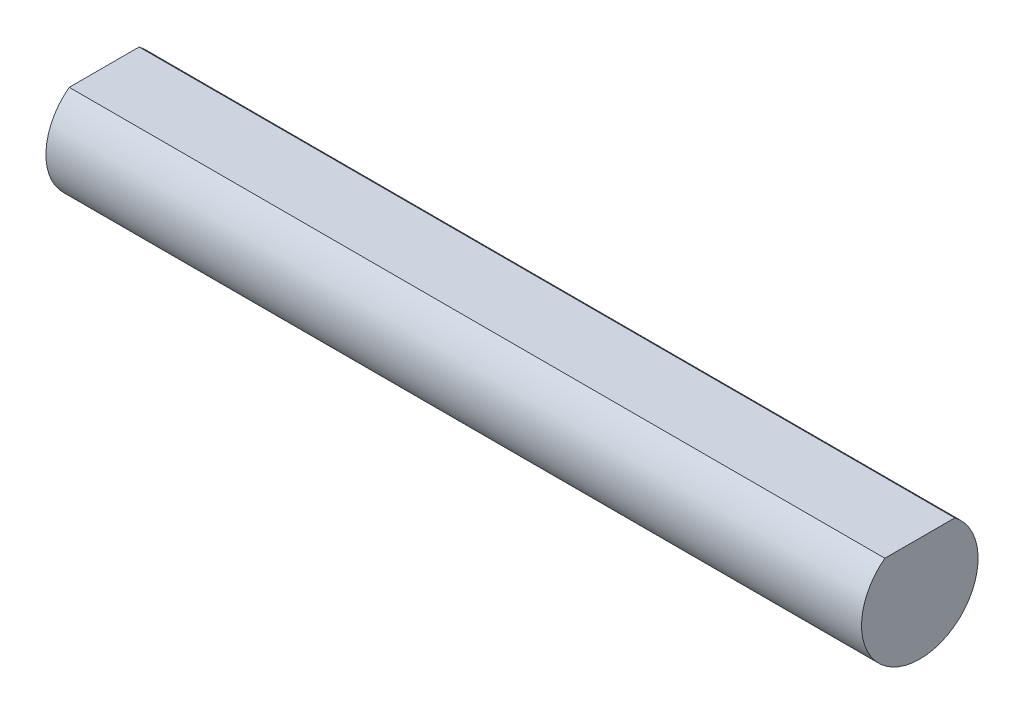
ISO-10303-21;
HEADER;
FILE_DESCRIPTION(('STEP AP214'),'2;1');
FILE_NAME('part.step','',(''),(''),'','','');
FILE_SCHEMA(('AUTOMOTIVE_DESIGN { 1 0 10303 214 1 1 1 1 }'));
ENDSEC;
DATA;
#1=APPLICATION_CONTEXT('core data for automotive mechanical design processes');
#2=APPLICATION_PROTOCOL_DEFINITION('international standard','automotive_design',2000,#1);
#3=PRODUCT_CONTEXT('',#1,'mechanical');
#4=PRODUCT('Part','Part','',(#3));
#5=PRODUCT_RELATED_PRODUCT_CATEGORY('part','',(#4));
#6=PRODUCT_DEFINITION_FORMATION('','',#4);
#7=PRODUCT_DEFINITION_CONTEXT('part definition',#1,'design');
#8=PRODUCT_DEFINITION('design','',#6,#7);
#9=PRODUCT_DEFINITION_SHAPE('','',#8);
#10=(LENGTH_UNIT() NAMED_UNIT(*) SI_UNIT(.MILLI.,.METRE.));
#11=(NAMED_UNIT(*) PLANE_ANGLE_UNIT() SI_UNIT($,.RADIAN.));
#12=(NAMED_UNIT(*) SI_UNIT($,.STERADIAN.) SOLID_ANGLE_UNIT());
#13=UNCERTAINTY_MEASURE_WITH_UNIT(LENGTH_MEASURE(1.E-05),#10,'distance_accuracy_value','');
#14=(GEOMETRIC_REPRESENTATION_CONTEXT(3) GLOBAL_UNCERTAINTY_ASSIGNED_CONTEXT((#13)) GLOBAL_UNIT_ASSIGNED_CONTEXT((#10,
#11,#12)) REPRESENTATION_CONTEXT('',''));
#15=CARTESIAN_POINT('',(0.,0.,0.));
#16=DIRECTION('',(0.,0.,1.));
#17=DIRECTION('',(1.,0.,0.));
#18=AXIS2_PLACEMENT_3D('',#15,#16,#17);
#19=CARTESIAN_POINT('',(22.225,0.,0.));
#20=DIRECTION('',(-1.,0.,0.));
#21=DIRECTION('',(0.,0.,1.));
#22=AXIS2_PLACEMENT_3D('',#19,#20,#21);
#23=CYLINDRICAL_SURFACE('',#22,3.175);
#24=CARTESIAN_POINT('',(-22.225,0.,0.));
#25=DIRECTION('',(1.,0.,0.));
#26=DIRECTION('',(0.,0.,-1.));
#27=AXIS2_PLACEMENT_3D('',#24,#25,#26);
#28=CIRCLE('',#27,3.175);
#29=CARTESIAN_POINT('',(-22.225,2.54,1.905));
#30=VERTEX_POINT('',#29);
#31=CARTESIAN_POINT('',(-22.225,2.54,-1.905));
#32=VERTEX_POINT('',#31);
#33=EDGE_CURVE('E71',#30,#32,#28,.T.);
#34=ORIENTED_EDGE('',*,*,#33,.T.);
#35=DIRECTION('',(-1.,0.,0.));
#36=VECTOR('',#35,1.);
#37=CARTESIAN_POINT('',(22.225,2.54,-1.905));
#38=LINE('',#37,#36);
#39=CARTESIAN_POINT('',(22.225,2.54,-1.905));
#40=VERTEX_POINT('',#39);
#41=EDGE_CURVE('E11',#40,#32,#38,.T.);
#42=ORIENTED_EDGE('',*,*,#41,.F.);
#43=CARTESIAN_POINT('',(22.225,0.,0.));
#44=DIRECTION('',(1.,0.,0.));
#45=DIRECTION('',(0.,0.,-1.));
#46=AXIS2_PLACEMENT_3D('',#43,#44,#45);
#47=CIRCLE('',#46,3.175);
#48=CARTESIAN_POINT('',(22.225,2.54,1.90499999999999));
#49=VERTEX_POINT('',#48);
#50=EDGE_CURVE('E70',#49,#40,#47,.T.);
#51=ORIENTED_EDGE('',*,*,#50,.F.);
#52=DIRECTION('',(-1.,0.,0.));
#53=VECTOR('',#52,1.);
#54=CARTESIAN_POINT('',(22.225,2.54,1.90499999999999));
#55=LINE('',#54,#53);
#56=EDGE_CURVE('E43',#49,#30,#55,.T.);
#57=ORIENTED_EDGE('',*,*,#56,.T.);
#58=EDGE_LOOP('',(#34,#42,#51,#57));
#59=FACE_BOUND('',#58,.T.);
#60=ADVANCED_FACE('F34',(#59),#23,.T.);
#61=CARTESIAN_POINT('',(22.225,2.54,1.90499999999999));
#62=DIRECTION('',(0.,-1.,0.));
#63=DIRECTION('',(0.,0.,-1.));
#64=AXIS2_PLACEMENT_3D('',#61,#62,#63);
#65=PLANE('',#64);
#66=DIRECTION('',(0.,0.,1.));
#67=VECTOR('',#66,1.);
#68=CARTESIAN_POINT('',(-22.225,2.54,1.905));
#69=LINE('',#68,#67);
#70=EDGE_CURVE('E62',#32,#30,#69,.T.);
#71=ORIENTED_EDGE('',*,*,#70,.T.);
#72=ORIENTED_EDGE('',*,*,#56,.F.);
#73=DIRECTION('',(0.,0.,1.));
#74=VECTOR('',#73,1.);
#75=CARTESIAN_POINT('',(22.225,2.54,1.90499999999999));
#76=LINE('',#75,#74);
#77=EDGE_CURVE('E53',#40,#49,#76,.T.);
#78=ORIENTED_EDGE('',*,*,#77,.F.);
#79=ORIENTED_EDGE('',*,*,#41,.T.);
#80=EDGE_LOOP('',(#71,#72,#78,#79));
#81=FACE_BOUND('',#80,.T.);
#82=ADVANCED_FACE('F65',(#81),#65,.F.);
#83=CARTESIAN_POINT('',(22.225,0.,0.));
#84=DIRECTION('',(1.,0.,0.));
#85=DIRECTION('',(0.,0.,-1.));
#86=AXIS2_PLACEMENT_3D('',#83,#84,#85);
#87=PLANE('',#86);
#88=ORIENTED_EDGE('',*,*,#50,.T.);
#89=ORIENTED_EDGE('',*,*,#77,.T.);
#90=EDGE_LOOP('',(#88,#89));
#91=FACE_BOUND('',#90,.T.);
#92=ADVANCED_FACE('F82',(#91),#87,.T.);
#93=CARTESIAN_POINT('',(-22.225,0.,0.));
#94=DIRECTION('',(1.,0.,0.));
#95=DIRECTION('',(0.,0.,-1.));
#96=AXIS2_PLACEMENT_3D('',#93,#94,#95);
#97=PLANE('',#96);
#98=ORIENTED_EDGE('',*,*,#33,.F.);
#99=ORIENTED_EDGE('',*,*,#70,.F.);
#100=EDGE_LOOP('',(#98,#99));
#101=FACE_BOUND('',#100,.T.);
#102=ADVANCED_FACE('F75',(#101),#97,.F.);
#103=CLOSED_SHELL('',(#60,#82,#92,#102));
#104=MANIFOLD_SOLID_BREP('B2',#103);
#105=ADVANCED_BREP_SHAPE_REPRESENTATION('',(#18,#104),#14);
#106=SHAPE_DEFINITION_REPRESENTATION(#9,#105);
ENDSEC;
END-ISO-10303-21;
